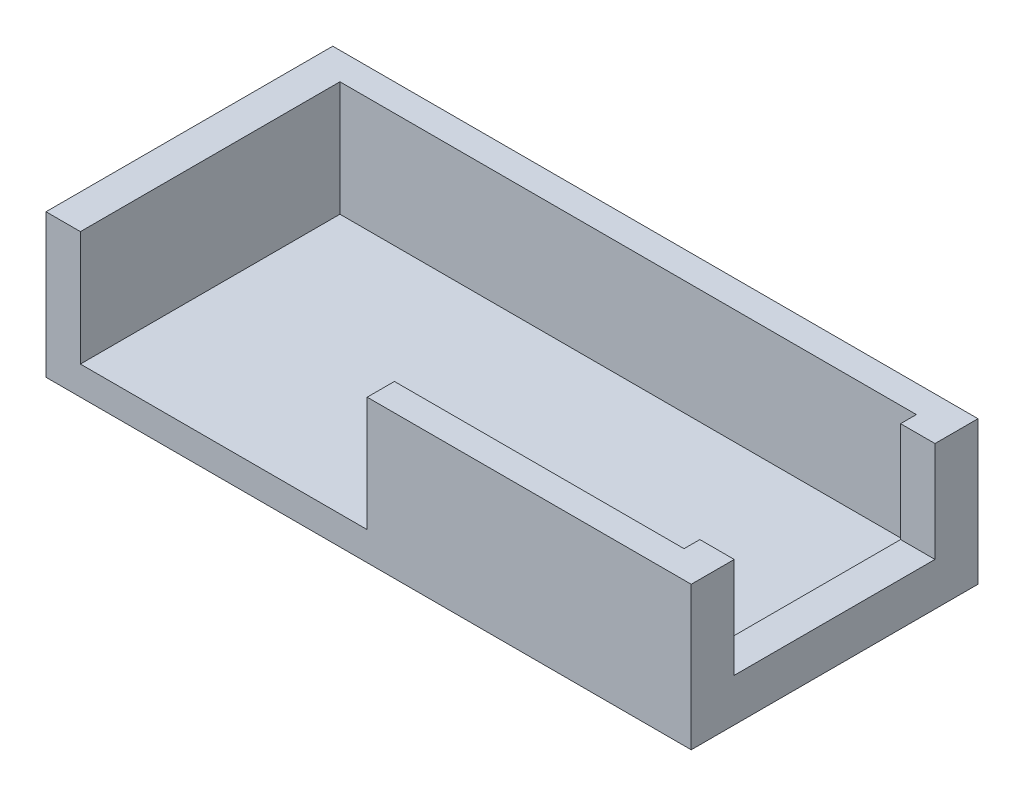
ISO-10303-21;
HEADER;
FILE_DESCRIPTION(('STEP AP214'),'2;1');
FILE_NAME('part.step','',(''),(''),'','','');
FILE_SCHEMA(('AUTOMOTIVE_DESIGN { 1 0 10303 214 1 1 1 1 }'));
ENDSEC;
DATA;
#1=APPLICATION_CONTEXT('core data for automotive mechanical design processes');
#2=APPLICATION_PROTOCOL_DEFINITION('international standard','automotive_design',2000,#1);
#3=PRODUCT_CONTEXT('',#1,'mechanical');
#4=PRODUCT('Part','Part','',(#3));
#5=PRODUCT_RELATED_PRODUCT_CATEGORY('part','',(#4));
#6=PRODUCT_DEFINITION_FORMATION('','',#4);
#7=PRODUCT_DEFINITION_CONTEXT('part definition',#1,'design');
#8=PRODUCT_DEFINITION('design','',#6,#7);
#9=PRODUCT_DEFINITION_SHAPE('','',#8);
#10=(LENGTH_UNIT() NAMED_UNIT(*) SI_UNIT(.MILLI.,.METRE.));
#11=(NAMED_UNIT(*) PLANE_ANGLE_UNIT() SI_UNIT($,.RADIAN.));
#12=(NAMED_UNIT(*) SI_UNIT($,.STERADIAN.) SOLID_ANGLE_UNIT());
#13=UNCERTAINTY_MEASURE_WITH_UNIT(LENGTH_MEASURE(1.E-05),#10,'distance_accuracy_value','');
#14=(GEOMETRIC_REPRESENTATION_CONTEXT(3) GLOBAL_UNCERTAINTY_ASSIGNED_CONTEXT((#13)) GLOBAL_UNIT_ASSIGNED_CONTEXT((#10,
#11,#12)) REPRESENTATION_CONTEXT('',''));
#15=CARTESIAN_POINT('',(0.,0.,0.));
#16=DIRECTION('',(0.,0.,1.));
#17=DIRECTION('',(1.,0.,0.));
#18=AXIS2_PLACEMENT_3D('',#15,#16,#17);
#19=CARTESIAN_POINT('',(0.,10.,0.));
#20=DIRECTION('',(0.,-1.,0.));
#21=DIRECTION('',(0.,0.,-1.));
#22=AXIS2_PLACEMENT_3D('',#19,#20,#21);
#23=PLANE('',#22);
#24=DIRECTION('',(1.,0.,0.));
#25=VECTOR('',#24,1.);
#26=CARTESIAN_POINT('',(-22.5,10.,10.));
#27=LINE('',#26,#25);
#28=CARTESIAN_POINT('',(-22.5,10.,10.));
#29=VERTEX_POINT('',#28);
#30=CARTESIAN_POINT('',(-20.1,10.,10.));
#31=VERTEX_POINT('',#30);
#32=EDGE_CURVE('E220',#29,#31,#27,.T.);
#33=ORIENTED_EDGE('',*,*,#32,.T.);
#34=DIRECTION('',(0.,0.,1.));
#35=VECTOR('',#34,1.);
#36=CARTESIAN_POINT('',(-20.1,10.,8.1));
#37=LINE('',#36,#35);
#38=CARTESIAN_POINT('',(-20.1,10.,-8.1));
#39=VERTEX_POINT('',#38);
#40=EDGE_CURVE('E156',#39,#31,#37,.T.);
#41=ORIENTED_EDGE('',*,*,#40,.F.);
#42=DIRECTION('',(-1.,0.,0.));
#43=VECTOR('',#42,1.);
#44=CARTESIAN_POINT('',(20.1,10.,-8.1));
#45=LINE('',#44,#43);
#46=CARTESIAN_POINT('',(20.1,10.,-8.1));
#47=VERTEX_POINT('',#46);
#48=EDGE_CURVE('E150',#47,#39,#45,.T.);
#49=ORIENTED_EDGE('',*,*,#48,.F.);
#50=DIRECTION('',(0.,0.,-1.));
#51=VECTOR('',#50,1.);
#52=CARTESIAN_POINT('',(20.1,10.,8.1));
#53=LINE('',#52,#51);
#54=CARTESIAN_POINT('',(20.1,10.,-7.));
#55=VERTEX_POINT('',#54);
#56=EDGE_CURVE('E197',#55,#47,#53,.T.);
#57=ORIENTED_EDGE('',*,*,#56,.F.);
#58=DIRECTION('',(1.,0.,0.));
#59=VECTOR('',#58,1.);
#60=CARTESIAN_POINT('',(14.5,10.,-7.));
#61=LINE('',#60,#59);
#62=CARTESIAN_POINT('',(22.5,10.,-7.));
#63=VERTEX_POINT('',#62);
#64=EDGE_CURVE('E181',#55,#63,#61,.T.);
#65=ORIENTED_EDGE('',*,*,#64,.T.);
#66=DIRECTION('',(0.,0.,-1.));
#67=VECTOR('',#66,1.);
#68=CARTESIAN_POINT('',(22.5,10.,10.));
#69=LINE('',#68,#67);
#70=CARTESIAN_POINT('',(22.5,10.,-10.));
#71=VERTEX_POINT('',#70);
#72=EDGE_CURVE('E215',#63,#71,#69,.T.);
#73=ORIENTED_EDGE('',*,*,#72,.T.);
#74=DIRECTION('',(-1.,0.,0.));
#75=VECTOR('',#74,1.);
#76=CARTESIAN_POINT('',(-22.5,10.,-10.));
#77=LINE('',#76,#75);
#78=CARTESIAN_POINT('',(-22.5,10.,-10.));
#79=VERTEX_POINT('',#78);
#80=EDGE_CURVE('E214',#71,#79,#77,.T.);
#81=ORIENTED_EDGE('',*,*,#80,.T.);
#82=DIRECTION('',(0.,0.,1.));
#83=VECTOR('',#82,1.);
#84=CARTESIAN_POINT('',(-22.5,10.,10.));
#85=LINE('',#84,#83);
#86=EDGE_CURVE('E217',#79,#29,#85,.T.);
#87=ORIENTED_EDGE('',*,*,#86,.T.);
#88=EDGE_LOOP('',(#33,#41,#49,#57,#65,#73,#81,#87));
#89=FACE_BOUND('',#88,.T.);
#90=ADVANCED_FACE('F39',(#89),#23,.F.);
#91=CARTESIAN_POINT('',(22.5,10.,10.));
#92=DIRECTION('',(-1.,0.,0.));
#93=DIRECTION('',(0.,0.,1.));
#94=AXIS2_PLACEMENT_3D('',#91,#92,#93);
#95=PLANE('',#94);
#96=ORIENTED_EDGE('',*,*,#72,.F.);
#97=DIRECTION('',(0.,1.,0.));
#98=VECTOR('',#97,1.);
#99=CARTESIAN_POINT('',(22.5,10.,-7.));
#100=LINE('',#99,#98);
#101=CARTESIAN_POINT('',(22.5,3.,-7.));
#102=VERTEX_POINT('',#101);
#103=EDGE_CURVE('E174',#102,#63,#100,.T.);
#104=ORIENTED_EDGE('',*,*,#103,.F.);
#105=DIRECTION('',(0.,0.,-1.));
#106=VECTOR('',#105,1.);
#107=CARTESIAN_POINT('',(22.5,3.,7.));
#108=LINE('',#107,#106);
#109=CARTESIAN_POINT('',(22.5,3.,7.));
#110=VERTEX_POINT('',#109);
#111=EDGE_CURVE('E178',#110,#102,#108,.T.);
#112=ORIENTED_EDGE('',*,*,#111,.F.);
#113=DIRECTION('',(0.,-1.,0.));
#114=VECTOR('',#113,1.);
#115=CARTESIAN_POINT('',(22.5,10.,7.));
#116=LINE('',#115,#114);
#117=CARTESIAN_POINT('',(22.5,10.,7.));
#118=VERTEX_POINT('',#117);
#119=EDGE_CURVE('E176',#118,#110,#116,.T.);
#120=ORIENTED_EDGE('',*,*,#119,.F.);
#121=CARTESIAN_POINT('',(22.5,10.,10.));
#122=VERTEX_POINT('',#121);
#123=EDGE_CURVE('E211',#122,#118,#69,.T.);
#124=ORIENTED_EDGE('',*,*,#123,.F.);
#125=DIRECTION('',(0.,-1.,0.));
#126=VECTOR('',#125,1.);
#127=CARTESIAN_POINT('',(22.5,10.,10.));
#128=LINE('',#127,#126);
#129=CARTESIAN_POINT('',(22.5,0.,10.));
#130=VERTEX_POINT('',#129);
#131=EDGE_CURVE('E222',#122,#130,#128,.T.);
#132=ORIENTED_EDGE('',*,*,#131,.T.);
#133=DIRECTION('',(0.,0.,-1.));
#134=VECTOR('',#133,1.);
#135=CARTESIAN_POINT('',(22.5,0.,10.));
#136=LINE('',#135,#134);
#137=CARTESIAN_POINT('',(22.5,0.,-10.));
#138=VERTEX_POINT('',#137);
#139=EDGE_CURVE('E205',#130,#138,#136,.T.);
#140=ORIENTED_EDGE('',*,*,#139,.T.);
#141=DIRECTION('',(0.,-1.,0.));
#142=VECTOR('',#141,1.);
#143=CARTESIAN_POINT('',(22.5,10.,-10.));
#144=LINE('',#143,#142);
#145=EDGE_CURVE('E239',#71,#138,#144,.T.);
#146=ORIENTED_EDGE('',*,*,#145,.F.);
#147=EDGE_LOOP('',(#96,#104,#112,#120,#124,#132,#140,#146));
#148=FACE_BOUND('',#147,.T.);
#149=ADVANCED_FACE('F41',(#148),#95,.F.);
#150=CARTESIAN_POINT('',(-22.5,10.,-10.));
#151=DIRECTION('',(0.,0.,1.));
#152=DIRECTION('',(1.,0.,0.));
#153=AXIS2_PLACEMENT_3D('',#150,#151,#152);
#154=PLANE('',#153);
#155=DIRECTION('',(-1.,0.,0.));
#156=VECTOR('',#155,1.);
#157=CARTESIAN_POINT('',(-22.5,0.,-10.));
#158=LINE('',#157,#156);
#159=CARTESIAN_POINT('',(-22.5,0.,-10.));
#160=VERTEX_POINT('',#159);
#161=EDGE_CURVE('E225',#138,#160,#158,.T.);
#162=ORIENTED_EDGE('',*,*,#161,.T.);
#163=DIRECTION('',(0.,-1.,0.));
#164=VECTOR('',#163,1.);
#165=CARTESIAN_POINT('',(-22.5,10.,-10.));
#166=LINE('',#165,#164);
#167=EDGE_CURVE('E236',#79,#160,#166,.T.);
#168=ORIENTED_EDGE('',*,*,#167,.F.);
#169=ORIENTED_EDGE('',*,*,#80,.F.);
#170=ORIENTED_EDGE('',*,*,#145,.T.);
#171=EDGE_LOOP('',(#162,#168,#169,#170));
#172=FACE_BOUND('',#171,.T.);
#173=ADVANCED_FACE('F263',(#172),#154,.F.);
#174=CARTESIAN_POINT('',(-22.5,10.,10.));
#175=DIRECTION('',(1.,0.,0.));
#176=DIRECTION('',(0.,0.,-1.));
#177=AXIS2_PLACEMENT_3D('',#174,#175,#176);
#178=PLANE('',#177);
#179=DIRECTION('',(0.,0.,1.));
#180=VECTOR('',#179,1.);
#181=CARTESIAN_POINT('',(-22.5,0.,10.));
#182=LINE('',#181,#180);
#183=CARTESIAN_POINT('',(-22.5,0.,10.));
#184=VERTEX_POINT('',#183);
#185=EDGE_CURVE('E227',#160,#184,#182,.T.);
#186=ORIENTED_EDGE('',*,*,#185,.T.);
#187=DIRECTION('',(0.,-1.,0.));
#188=VECTOR('',#187,1.);
#189=CARTESIAN_POINT('',(-22.5,10.,10.));
#190=LINE('',#189,#188);
#191=EDGE_CURVE('E233',#29,#184,#190,.T.);
#192=ORIENTED_EDGE('',*,*,#191,.F.);
#193=ORIENTED_EDGE('',*,*,#86,.F.);
#194=ORIENTED_EDGE('',*,*,#167,.T.);
#195=EDGE_LOOP('',(#186,#192,#193,#194));
#196=FACE_BOUND('',#195,.T.);
#197=ADVANCED_FACE('F268',(#196),#178,.F.);
#198=CARTESIAN_POINT('',(-22.5,10.,10.));
#199=DIRECTION('',(0.,0.,-1.));
#200=DIRECTION('',(-1.,0.,0.));
#201=AXIS2_PLACEMENT_3D('',#198,#199,#200);
#202=PLANE('',#201);
#203=DIRECTION('',(1.,0.,0.));
#204=VECTOR('',#203,1.);
#205=CARTESIAN_POINT('',(-20.1,2.,10.));
#206=LINE('',#205,#204);
#207=CARTESIAN_POINT('',(-20.1,2.,10.));
#208=VERTEX_POINT('',#207);
#209=CARTESIAN_POINT('',(-0.0999999999999915,2.,10.));
#210=VERTEX_POINT('',#209);
#211=EDGE_CURVE('E143',#208,#210,#206,.T.);
#212=ORIENTED_EDGE('',*,*,#211,.F.);
#213=DIRECTION('',(0.,-1.,0.));
#214=VECTOR('',#213,1.);
#215=CARTESIAN_POINT('',(-20.1,10.,10.));
#216=LINE('',#215,#214);
#217=EDGE_CURVE('E153',#31,#208,#216,.T.);
#218=ORIENTED_EDGE('',*,*,#217,.F.);
#219=ORIENTED_EDGE('',*,*,#32,.F.);
#220=ORIENTED_EDGE('',*,*,#191,.T.);
#221=DIRECTION('',(1.,0.,0.));
#222=VECTOR('',#221,1.);
#223=CARTESIAN_POINT('',(-22.5,0.,10.));
#224=LINE('',#223,#222);
#225=EDGE_CURVE('E229',#184,#130,#224,.T.);
#226=ORIENTED_EDGE('',*,*,#225,.T.);
#227=ORIENTED_EDGE('',*,*,#131,.F.);
#228=CARTESIAN_POINT('',(-0.0999999999999925,10.,10.));
#229=VERTEX_POINT('',#228);
#230=EDGE_CURVE('E219',#229,#122,#27,.T.);
#231=ORIENTED_EDGE('',*,*,#230,.F.);
#232=DIRECTION('',(0.,1.,0.));
#233=VECTOR('',#232,1.);
#234=CARTESIAN_POINT('',(-0.0999999999999925,10.,10.));
#235=LINE('',#234,#233);
#236=EDGE_CURVE('E163',#210,#229,#235,.T.);
#237=ORIENTED_EDGE('',*,*,#236,.F.);
#238=EDGE_LOOP('',(#212,#218,#219,#220,#226,#227,#231,#237));
#239=FACE_BOUND('',#238,.T.);
#240=ADVANCED_FACE('F161',(#239),#202,.F.);
#241=DIRECTION('',(1.,0.,0.));
#242=VECTOR('',#241,1.);
#243=CARTESIAN_POINT('',(20.1,10.,8.1));
#244=LINE('',#243,#242);
#245=CARTESIAN_POINT('',(-0.0999999999999925,10.,8.1));
#246=VERTEX_POINT('',#245);
#247=CARTESIAN_POINT('',(20.1,10.,8.1));
#248=VERTEX_POINT('',#247);
#249=EDGE_CURVE('E195',#246,#248,#244,.T.);
#250=ORIENTED_EDGE('',*,*,#249,.F.);
#251=DIRECTION('',(0.,0.,1.));
#252=VECTOR('',#251,1.);
#253=CARTESIAN_POINT('',(-0.0999999999999925,10.,2.));
#254=LINE('',#253,#252);
#255=EDGE_CURVE('E167',#246,#229,#254,.T.);
#256=ORIENTED_EDGE('',*,*,#255,.T.);
#257=ORIENTED_EDGE('',*,*,#230,.T.);
#258=ORIENTED_EDGE('',*,*,#123,.T.);
#259=DIRECTION('',(1.,0.,0.));
#260=VECTOR('',#259,1.);
#261=CARTESIAN_POINT('',(14.5,10.,7.));
#262=LINE('',#261,#260);
#263=CARTESIAN_POINT('',(20.1,10.,7.));
#264=VERTEX_POINT('',#263);
#265=EDGE_CURVE('E185',#264,#118,#262,.T.);
#266=ORIENTED_EDGE('',*,*,#265,.F.);
#267=EDGE_CURVE('E198',#248,#264,#53,.T.);
#268=ORIENTED_EDGE('',*,*,#267,.F.);
#269=EDGE_LOOP('',(#250,#256,#257,#258,#266,#268));
#270=FACE_BOUND('',#269,.T.);
#271=ADVANCED_FACE('F275',(#270),#23,.F.);
#272=CARTESIAN_POINT('',(0.,0.,0.));
#273=DIRECTION('',(0.,-1.,0.));
#274=DIRECTION('',(0.,0.,-1.));
#275=AXIS2_PLACEMENT_3D('',#272,#273,#274);
#276=PLANE('',#275);
#277=ORIENTED_EDGE('',*,*,#139,.F.);
#278=ORIENTED_EDGE('',*,*,#225,.F.);
#279=ORIENTED_EDGE('',*,*,#185,.F.);
#280=ORIENTED_EDGE('',*,*,#161,.F.);
#281=EDGE_LOOP('',(#277,#278,#279,#280));
#282=FACE_BOUND('',#281,.T.);
#283=ADVANCED_FACE('F273',(#282),#276,.T.);
#284=CARTESIAN_POINT('',(-20.1,2.,8.1));
#285=DIRECTION('',(-1.,0.,0.));
#286=DIRECTION('',(0.,0.,1.));
#287=AXIS2_PLACEMENT_3D('',#284,#285,#286);
#288=PLANE('',#287);
#289=ORIENTED_EDGE('',*,*,#217,.T.);
#290=DIRECTION('',(0.,0.,1.));
#291=VECTOR('',#290,1.);
#292=CARTESIAN_POINT('',(-20.1,2.,8.1));
#293=LINE('',#292,#291);
#294=CARTESIAN_POINT('',(-20.1,2.,-8.1));
#295=VERTEX_POINT('',#294);
#296=EDGE_CURVE('E139',#295,#208,#293,.T.);
#297=ORIENTED_EDGE('',*,*,#296,.F.);
#298=DIRECTION('',(0.,1.,0.));
#299=VECTOR('',#298,1.);
#300=CARTESIAN_POINT('',(-20.1,2.,-8.1));
#301=LINE('',#300,#299);
#302=EDGE_CURVE('E203',#295,#39,#301,.T.);
#303=ORIENTED_EDGE('',*,*,#302,.T.);
#304=ORIENTED_EDGE('',*,*,#40,.T.);
#305=EDGE_LOOP('',(#289,#297,#303,#304));
#306=FACE_BOUND('',#305,.T.);
#307=ADVANCED_FACE('F154',(#306),#288,.F.);
#308=CARTESIAN_POINT('',(20.1,2.,-8.1));
#309=DIRECTION('',(0.,0.,-1.));
#310=DIRECTION('',(-1.,0.,0.));
#311=AXIS2_PLACEMENT_3D('',#308,#309,#310);
#312=PLANE('',#311);
#313=ORIENTED_EDGE('',*,*,#48,.T.);
#314=ORIENTED_EDGE('',*,*,#302,.F.);
#315=DIRECTION('',(-1.,0.,0.));
#316=VECTOR('',#315,1.);
#317=CARTESIAN_POINT('',(20.1,2.,-8.1));
#318=LINE('',#317,#316);
#319=CARTESIAN_POINT('',(20.1,2.,-8.1));
#320=VERTEX_POINT('',#319);
#321=EDGE_CURVE('E147',#320,#295,#318,.T.);
#322=ORIENTED_EDGE('',*,*,#321,.F.);
#323=DIRECTION('',(0.,1.,0.));
#324=VECTOR('',#323,1.);
#325=CARTESIAN_POINT('',(20.1,2.,-8.1));
#326=LINE('',#325,#324);
#327=EDGE_CURVE('E206',#320,#47,#326,.T.);
#328=ORIENTED_EDGE('',*,*,#327,.T.);
#329=EDGE_LOOP('',(#313,#314,#322,#328));
#330=FACE_BOUND('',#329,.T.);
#331=ADVANCED_FACE('F282',(#330),#312,.F.);
#332=CARTESIAN_POINT('',(20.1,2.,8.1));
#333=DIRECTION('',(1.,0.,0.));
#334=DIRECTION('',(0.,0.,-1.));
#335=AXIS2_PLACEMENT_3D('',#332,#333,#334);
#336=PLANE('',#335);
#337=DIRECTION('',(0.,0.,-1.));
#338=VECTOR('',#337,1.);
#339=CARTESIAN_POINT('',(20.1,3.,8.1));
#340=LINE('',#339,#338);
#341=CARTESIAN_POINT('',(20.1,3.,7.));
#342=VERTEX_POINT('',#341);
#343=CARTESIAN_POINT('',(20.1,3.,-7.));
#344=VERTEX_POINT('',#343);
#345=EDGE_CURVE('E47',#342,#344,#340,.T.);
#346=ORIENTED_EDGE('',*,*,#345,.T.);
#347=DIRECTION('',(0.,1.,0.));
#348=VECTOR('',#347,1.);
#349=CARTESIAN_POINT('',(20.1,2.,-7.));
#350=LINE('',#349,#348);
#351=EDGE_CURVE('E11',#344,#55,#350,.T.);
#352=ORIENTED_EDGE('',*,*,#351,.T.);
#353=ORIENTED_EDGE('',*,*,#56,.T.);
#354=ORIENTED_EDGE('',*,*,#327,.F.);
#355=DIRECTION('',(0.,0.,-1.));
#356=VECTOR('',#355,1.);
#357=CARTESIAN_POINT('',(20.1,2.,8.1));
#358=LINE('',#357,#356);
#359=CARTESIAN_POINT('',(20.1,2.,8.1));
#360=VERTEX_POINT('',#359);
#361=EDGE_CURVE('E190',#360,#320,#358,.T.);
#362=ORIENTED_EDGE('',*,*,#361,.F.);
#363=DIRECTION('',(0.,1.,0.));
#364=VECTOR('',#363,1.);
#365=CARTESIAN_POINT('',(20.1,2.,8.1));
#366=LINE('',#365,#364);
#367=EDGE_CURVE('E193',#360,#248,#366,.T.);
#368=ORIENTED_EDGE('',*,*,#367,.T.);
#369=ORIENTED_EDGE('',*,*,#267,.T.);
#370=DIRECTION('',(0.,-1.,0.));
#371=VECTOR('',#370,1.);
#372=CARTESIAN_POINT('',(20.1,2.,7.));
#373=LINE('',#372,#371);
#374=EDGE_CURVE('E242',#264,#342,#373,.T.);
#375=ORIENTED_EDGE('',*,*,#374,.T.);
#376=EDGE_LOOP('',(#346,#352,#353,#354,#362,#368,#369,#375));
#377=FACE_BOUND('',#376,.T.);
#378=ADVANCED_FACE('F246',(#377),#336,.F.);
#379=CARTESIAN_POINT('',(20.1,2.,8.1));
#380=DIRECTION('',(0.,0.,1.));
#381=DIRECTION('',(1.,0.,0.));
#382=AXIS2_PLACEMENT_3D('',#379,#380,#381);
#383=PLANE('',#382);
#384=DIRECTION('',(1.,0.,0.));
#385=VECTOR('',#384,1.);
#386=CARTESIAN_POINT('',(20.1,2.,8.1));
#387=LINE('',#386,#385);
#388=CARTESIAN_POINT('',(-0.0999999999999925,2.,8.1));
#389=VERTEX_POINT('',#388);
#390=EDGE_CURVE('E149',#389,#360,#387,.T.);
#391=ORIENTED_EDGE('',*,*,#390,.F.);
#392=DIRECTION('',(0.,1.,0.));
#393=VECTOR('',#392,1.);
#394=CARTESIAN_POINT('',(-0.0999999999999925,2.,8.1));
#395=LINE('',#394,#393);
#396=EDGE_CURVE('E170',#389,#246,#395,.T.);
#397=ORIENTED_EDGE('',*,*,#396,.T.);
#398=ORIENTED_EDGE('',*,*,#249,.T.);
#399=ORIENTED_EDGE('',*,*,#367,.F.);
#400=EDGE_LOOP('',(#391,#397,#398,#399));
#401=FACE_BOUND('',#400,.T.);
#402=ADVANCED_FACE('F295',(#401),#383,.F.);
#403=CARTESIAN_POINT('',(0.,2.,0.));
#404=DIRECTION('',(0.,1.,0.));
#405=DIRECTION('',(0.,0.,1.));
#406=AXIS2_PLACEMENT_3D('',#403,#404,#405);
#407=PLANE('',#406);
#408=ORIENTED_EDGE('',*,*,#296,.T.);
#409=ORIENTED_EDGE('',*,*,#211,.T.);
#410=DIRECTION('',(0.,0.,1.));
#411=VECTOR('',#410,1.);
#412=CARTESIAN_POINT('',(-0.0999999999999915,2.,2.));
#413=LINE('',#412,#411);
#414=EDGE_CURVE('E54',#389,#210,#413,.T.);
#415=ORIENTED_EDGE('',*,*,#414,.F.);
#416=ORIENTED_EDGE('',*,*,#390,.T.);
#417=ORIENTED_EDGE('',*,*,#361,.T.);
#418=ORIENTED_EDGE('',*,*,#321,.T.);
#419=EDGE_LOOP('',(#408,#409,#415,#416,#417,#418));
#420=FACE_BOUND('',#419,.T.);
#421=ADVANCED_FACE('F141',(#420),#407,.T.);
#422=CARTESIAN_POINT('',(14.5,10.,-7.));
#423=DIRECTION('',(0.,0.,-1.));
#424=DIRECTION('',(0.,1.,0.));
#425=AXIS2_PLACEMENT_3D('',#422,#423,#424);
#426=PLANE('',#425);
#427=DIRECTION('',(1.,0.,0.));
#428=VECTOR('',#427,1.);
#429=CARTESIAN_POINT('',(14.5,3.,-7.));
#430=LINE('',#429,#428);
#431=EDGE_CURVE('E182',#344,#102,#430,.T.);
#432=ORIENTED_EDGE('',*,*,#431,.T.);
#433=ORIENTED_EDGE('',*,*,#103,.T.);
#434=ORIENTED_EDGE('',*,*,#64,.F.);
#435=ORIENTED_EDGE('',*,*,#351,.F.);
#436=EDGE_LOOP('',(#432,#433,#434,#435));
#437=FACE_BOUND('',#436,.T.);
#438=ADVANCED_FACE('F254',(#437),#426,.F.);
#439=CARTESIAN_POINT('',(14.5,3.,7.));
#440=DIRECTION('',(0.,-1.,0.));
#441=DIRECTION('',(0.,0.,-1.));
#442=AXIS2_PLACEMENT_3D('',#439,#440,#441);
#443=PLANE('',#442);
#444=DIRECTION('',(1.,0.,0.));
#445=VECTOR('',#444,1.);
#446=CARTESIAN_POINT('',(14.5,3.,7.));
#447=LINE('',#446,#445);
#448=EDGE_CURVE('E62',#342,#110,#447,.T.);
#449=ORIENTED_EDGE('',*,*,#448,.T.);
#450=ORIENTED_EDGE('',*,*,#111,.T.);
#451=ORIENTED_EDGE('',*,*,#431,.F.);
#452=ORIENTED_EDGE('',*,*,#345,.F.);
#453=EDGE_LOOP('',(#449,#450,#451,#452));
#454=FACE_BOUND('',#453,.T.);
#455=ADVANCED_FACE('F250',(#454),#443,.F.);
#456=CARTESIAN_POINT('',(14.5,10.,7.));
#457=DIRECTION('',(0.,0.,1.));
#458=DIRECTION('',(0.,-1.,0.));
#459=AXIS2_PLACEMENT_3D('',#456,#457,#458);
#460=PLANE('',#459);
#461=ORIENTED_EDGE('',*,*,#265,.T.);
#462=ORIENTED_EDGE('',*,*,#119,.T.);
#463=ORIENTED_EDGE('',*,*,#448,.F.);
#464=ORIENTED_EDGE('',*,*,#374,.F.);
#465=EDGE_LOOP('',(#461,#462,#463,#464));
#466=FACE_BOUND('',#465,.T.);
#467=ADVANCED_FACE('F307',(#466),#460,.F.);
#468=CARTESIAN_POINT('',(-0.0999999999999925,10.,2.));
#469=DIRECTION('',(1.,0.,0.));
#470=DIRECTION('',(0.,1.,0.));
#471=AXIS2_PLACEMENT_3D('',#468,#469,#470);
#472=PLANE('',#471);
#473=ORIENTED_EDGE('',*,*,#414,.T.);
#474=ORIENTED_EDGE('',*,*,#236,.T.);
#475=ORIENTED_EDGE('',*,*,#255,.F.);
#476=ORIENTED_EDGE('',*,*,#396,.F.);
#477=EDGE_LOOP('',(#473,#474,#475,#476));
#478=FACE_BOUND('',#477,.T.);
#479=ADVANCED_FACE('F309',(#478),#472,.F.);
#480=CLOSED_SHELL('',(#90,#149,#173,#197,#240,#271,#283,#307,#331,#378,#402,#421,#438,#455,#467,#479));
#481=MANIFOLD_SOLID_BREP('B2',#480);
#482=ADVANCED_BREP_SHAPE_REPRESENTATION('',(#18,#481),#14);
#483=SHAPE_DEFINITION_REPRESENTATION(#9,#482);
ENDSEC;
END-ISO-10303-21;
